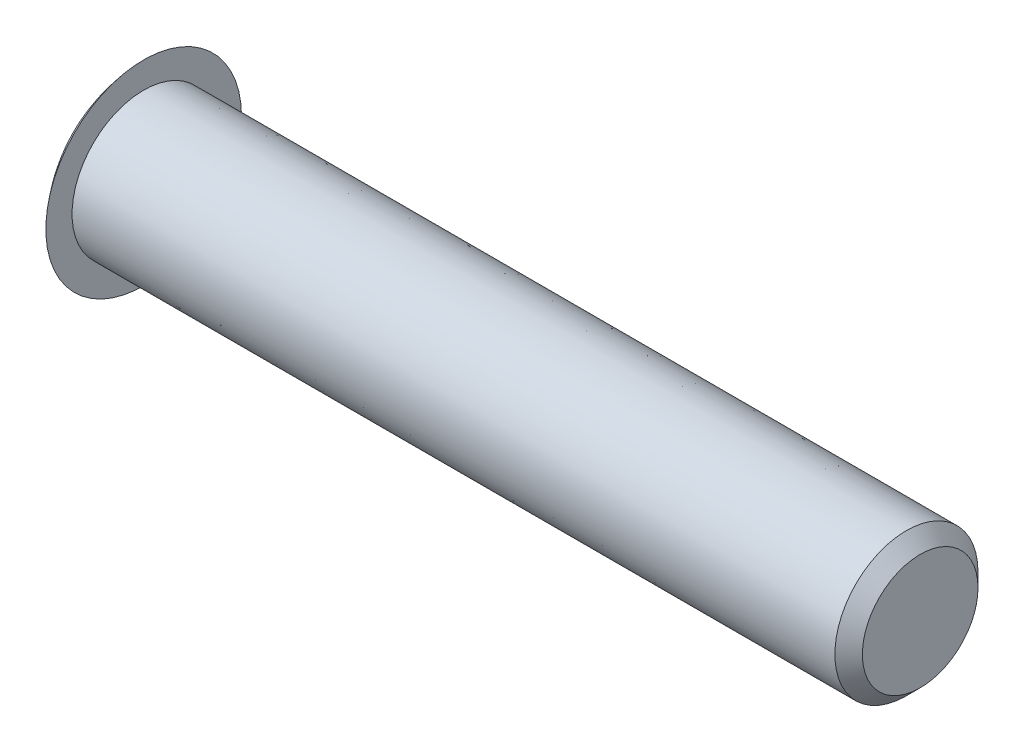
ISO-10303-21;
HEADER;
FILE_DESCRIPTION(('STEP AP214'),'2;1');
FILE_NAME('part.step','',(''),(''),'','','');
FILE_SCHEMA(('AUTOMOTIVE_DESIGN { 1 0 10303 214 1 1 1 1 }'));
ENDSEC;
DATA;
#1=APPLICATION_CONTEXT('core data for automotive mechanical design processes');
#2=APPLICATION_PROTOCOL_DEFINITION('international standard','automotive_design',2000,#1);
#3=PRODUCT_CONTEXT('',#1,'mechanical');
#4=PRODUCT('Part','Part','',(#3));
#5=PRODUCT_RELATED_PRODUCT_CATEGORY('part','',(#4));
#6=PRODUCT_DEFINITION_FORMATION('','',#4);
#7=PRODUCT_DEFINITION_CONTEXT('part definition',#1,'design');
#8=PRODUCT_DEFINITION('design','',#6,#7);
#9=PRODUCT_DEFINITION_SHAPE('','',#8);
#10=(LENGTH_UNIT() NAMED_UNIT(*) SI_UNIT(.MILLI.,.METRE.));
#11=(NAMED_UNIT(*) PLANE_ANGLE_UNIT() SI_UNIT($,.RADIAN.));
#12=(NAMED_UNIT(*) SI_UNIT($,.STERADIAN.) SOLID_ANGLE_UNIT());
#13=UNCERTAINTY_MEASURE_WITH_UNIT(LENGTH_MEASURE(1.E-05),#10,'distance_accuracy_value','');
#14=(GEOMETRIC_REPRESENTATION_CONTEXT(3) GLOBAL_UNCERTAINTY_ASSIGNED_CONTEXT((#13)) GLOBAL_UNIT_ASSIGNED_CONTEXT((#10,
#11,#12)) REPRESENTATION_CONTEXT('',''));
#15=CARTESIAN_POINT('',(0.,0.,0.));
#16=DIRECTION('',(0.,0.,1.));
#17=DIRECTION('',(1.,0.,0.));
#18=AXIS2_PLACEMENT_3D('',#15,#16,#17);
#19=CARTESIAN_POINT('',(8.75776397515528,1.3,0.));
#20=DIRECTION('',(1.,0.,0.));
#21=DIRECTION('',(0.,0.,-1.));
#22=AXIS2_PLACEMENT_3D('',#19,#20,#21);
#23=PLANE('',#22);
#24=CARTESIAN_POINT('',(8.75776397515528,0.,0.));
#25=DIRECTION('',(1.,0.,0.));
#26=DIRECTION('',(0.,0.,-1.));
#27=AXIS2_PLACEMENT_3D('',#24,#25,#26);
#28=CIRCLE('',#27,1.04998740756437);
#29=CARTESIAN_POINT('',(8.75776397515528,0.,-1.04998740756437));
#30=VERTEX_POINT('',#29);
#31=EDGE_CURVE('E60',#30,#30,#28,.T.);
#32=ORIENTED_EDGE('',*,*,#31,.T.);
#33=EDGE_LOOP('',(#32));
#34=FACE_BOUND('',#33,.T.);
#35=ADVANCED_FACE('F51',(#34),#23,.T.);
#36=CARTESIAN_POINT('',(-2.19661367900067,0.,0.924899905290998));
#37=DIRECTION('',(0.,-1.,0.));
#38=DIRECTION('',(0.,0.,-1.));
#39=AXIS2_PLACEMENT_3D('',#36,#37,#38);
#40=CIRCLE('',#39,4.15);
#41=TRIMMED_CURVE('',#40,(PARAMETER_VALUE(-1.34604141278142)),
(PARAMETER_VALUE(1.34604141278142)),.T.,.PARAMETER.);
#42=CARTESIAN_POINT('',(-2.19661367900067,0.,0.));
#43=DIRECTION('',(1.,0.,0.));
#44=AXIS1_PLACEMENT('',#42,#43);
#45=SURFACE_OF_REVOLUTION('',#41,#44);
#46=CARTESIAN_POINT('',(-6.24223602484472,0.,0.));
#47=VERTEX_POINT('',#46);
#48=VERTEX_LOOP('',#47);
#49=FACE_BOUND('',#48,.T.);
#50=CARTESIAN_POINT('',(-5.34638568523866,0.,0.));
#51=DIRECTION('',(1.,0.,0.));
#52=DIRECTION('',(0.,0.,-1.));
#53=AXIS2_PLACEMENT_3D('',#50,#51,#52);
#54=CIRCLE('',#53,1.77721709971073);
#55=CARTESIAN_POINT('',(-5.34638568523866,0.,-1.77721709971073));
#56=VERTEX_POINT('',#55);
#57=EDGE_CURVE('E70',#56,#56,#54,.T.);
#58=ORIENTED_EDGE('',*,*,#57,.F.);
#59=EDGE_LOOP('',(#58));
#60=FACE_BOUND('',#59,.T.);
#61=ADVANCED_FACE('F63',(#49,#60),#45,.T.);
#62=CARTESIAN_POINT('',(-5.34631446840924,0.,0.));
#63=DIRECTION('',(-1.,0.,0.));
#64=DIRECTION('',(0.,0.,1.));
#65=AXIS2_PLACEMENT_3D('',#62,#63,#64);
#66=CONICAL_SURFACE('',#65,1.30071036512956,1.57064687071439);
#67=ORIENTED_EDGE('',*,*,#57,.T.);
#68=EDGE_LOOP('',(#67));
#69=FACE_BOUND('',#68,.T.);
#70=CARTESIAN_POINT('',(-5.34631446840924,0.,0.));
#71=DIRECTION('',(1.,0.,0.));
#72=DIRECTION('',(0.,0.,-1.));
#73=AXIS2_PLACEMENT_3D('',#70,#71,#72);
#74=CIRCLE('',#73,1.30071036512956);
#75=CARTESIAN_POINT('',(-5.34631446840924,0.,-1.30071036512956));
#76=VERTEX_POINT('',#75);
#77=EDGE_CURVE('E73',#76,#76,#74,.T.);
#78=ORIENTED_EDGE('',*,*,#77,.F.);
#79=EDGE_LOOP('',(#78));
#80=FACE_BOUND('',#79,.T.);
#81=ADVANCED_FACE('F66',(#69,#80),#66,.T.);
#82=CARTESIAN_POINT('',(8.75776397515528,0.,0.));
#83=DIRECTION('',(-1.,0.,0.));
#84=DIRECTION('',(0.,0.,1.));
#85=AXIS2_PLACEMENT_3D('',#82,#83,#84);
#86=CONICAL_SURFACE('',#85,1.3,5.03659371859666E-05);
#87=CARTESIAN_POINT('',(8.50776397547293,0.,0.));
#88=DIRECTION('',(1.,0.,0.));
#89=DIRECTION('',(0.,0.,-1.));
#90=AXIS2_PLACEMENT_3D('',#87,#88,#89);
#91=CIRCLE('',#90,1.30001259148429);
#92=CARTESIAN_POINT('',(8.50776397547293,0.,-1.30001259148429));
#93=VERTEX_POINT('',#92);
#94=EDGE_CURVE('E11',#93,#93,#91,.F.);
#95=ORIENTED_EDGE('',*,*,#94,.T.);
#96=EDGE_LOOP('',(#95));
#97=FACE_BOUND('',#96,.T.);
#98=ORIENTED_EDGE('',*,*,#77,.T.);
#99=EDGE_LOOP('',(#98));
#100=FACE_BOUND('',#99,.T.);
#101=ADVANCED_FACE('F86',(#97,#100),#86,.T.);
#102=CARTESIAN_POINT('',(8.75776397515528,0.,0.));
#103=DIRECTION('',(-1.,0.,0.));
#104=DIRECTION('',(0.,0.,1.));
#105=AXIS2_PLACEMENT_3D('',#102,#103,#104);
#106=CONICAL_SURFACE('',#105,1.04998740756437,0.78544852933463);
#107=ORIENTED_EDGE('',*,*,#94,.F.);
#108=EDGE_LOOP('',(#107));
#109=FACE_BOUND('',#108,.T.);
#110=ORIENTED_EDGE('',*,*,#31,.F.);
#111=EDGE_LOOP('',(#110));
#112=FACE_BOUND('',#111,.T.);
#113=ADVANCED_FACE('F54',(#109,#112),#106,.T.);
#114=CLOSED_SHELL('',(#35,#61,#81,#101,#113));
#115=MANIFOLD_SOLID_BREP('B2',#114);
#116=ADVANCED_BREP_SHAPE_REPRESENTATION('',(#18,#115),#14);
#117=SHAPE_DEFINITION_REPRESENTATION(#9,#116);
ENDSEC;
END-ISO-10303-21;
